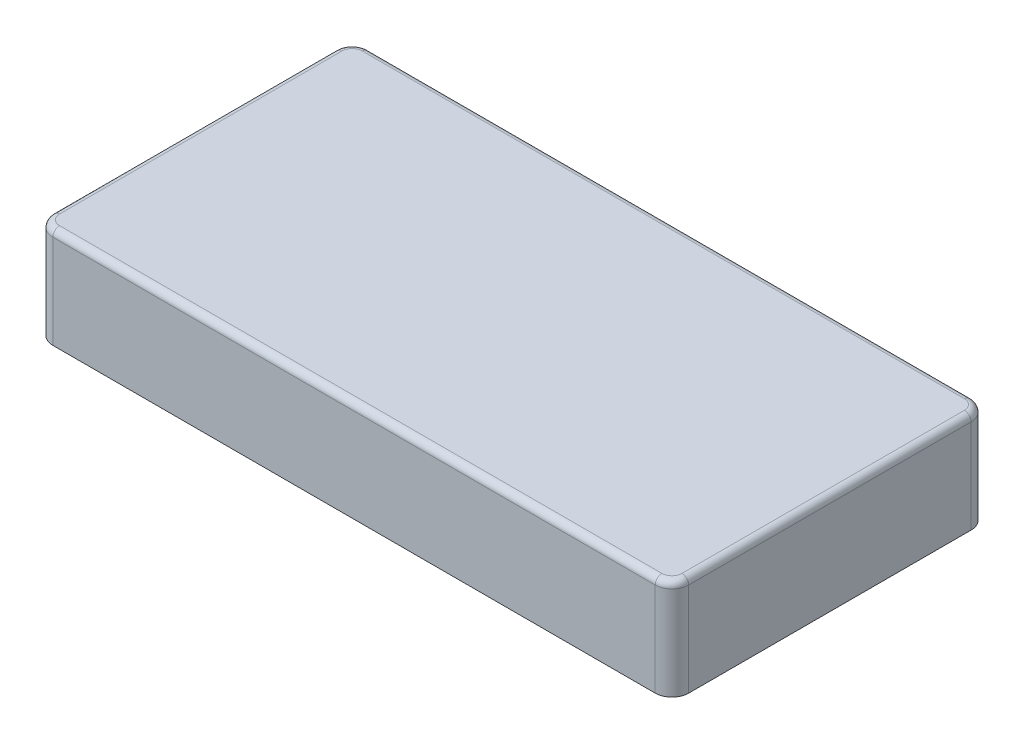
ISO-10303-21;
HEADER;
FILE_DESCRIPTION(('STEP AP214'),'2;1');
FILE_NAME('part.step','',(''),(''),'','','');
FILE_SCHEMA(('AUTOMOTIVE_DESIGN { 1 0 10303 214 1 1 1 1 }'));
ENDSEC;
DATA;
#1=APPLICATION_CONTEXT('core data for automotive mechanical design processes');
#2=APPLICATION_PROTOCOL_DEFINITION('international standard','automotive_design',2000,#1);
#3=PRODUCT_CONTEXT('',#1,'mechanical');
#4=PRODUCT('Part','Part','',(#3));
#5=PRODUCT_RELATED_PRODUCT_CATEGORY('part','',(#4));
#6=PRODUCT_DEFINITION_FORMATION('','',#4);
#7=PRODUCT_DEFINITION_CONTEXT('part definition',#1,'design');
#8=PRODUCT_DEFINITION('design','',#6,#7);
#9=PRODUCT_DEFINITION_SHAPE('','',#8);
#10=(LENGTH_UNIT() NAMED_UNIT(*) SI_UNIT(.MILLI.,.METRE.));
#11=(NAMED_UNIT(*) PLANE_ANGLE_UNIT() SI_UNIT($,.RADIAN.));
#12=(NAMED_UNIT(*) SI_UNIT($,.STERADIAN.) SOLID_ANGLE_UNIT());
#13=UNCERTAINTY_MEASURE_WITH_UNIT(LENGTH_MEASURE(1.E-05),#10,'distance_accuracy_value','');
#14=(GEOMETRIC_REPRESENTATION_CONTEXT(3) GLOBAL_UNCERTAINTY_ASSIGNED_CONTEXT((#13)) GLOBAL_UNIT_ASSIGNED_CONTEXT((#10,
#11,#12)) REPRESENTATION_CONTEXT('',''));
#15=CARTESIAN_POINT('',(0.,0.,0.));
#16=DIRECTION('',(0.,0.,1.));
#17=DIRECTION('',(1.,0.,0.));
#18=AXIS2_PLACEMENT_3D('',#15,#16,#17);
#19=CARTESIAN_POINT('',(9.,3.,-4.22));
#20=DIRECTION('',(0.,-1.,0.));
#21=DIRECTION('',(0.,0.,-1.));
#22=AXIS2_PLACEMENT_3D('',#19,#20,#21);
#23=CYLINDRICAL_SURFACE('',#22,0.5);
#24=DIRECTION('',(0.,-1.,0.));
#25=VECTOR('',#24,1.);
#26=CARTESIAN_POINT('',(9.,3.,-4.72));
#27=LINE('',#26,#25);
#28=CARTESIAN_POINT('',(9.,2.8,-4.72));
#29=VERTEX_POINT('',#28);
#30=CARTESIAN_POINT('',(9.,0.,-4.72));
#31=VERTEX_POINT('',#30);
#32=EDGE_CURVE('E126',#29,#31,#27,.T.);
#33=ORIENTED_EDGE('',*,*,#32,.F.);
#34=CARTESIAN_POINT('',(9.,2.8,-4.22));
#35=DIRECTION('',(0.,-1.,0.));
#36=DIRECTION('',(0.,0.,-1.));
#37=AXIS2_PLACEMENT_3D('',#34,#35,#36);
#38=CIRCLE('',#37,0.5);
#39=CARTESIAN_POINT('',(9.5,2.8,-4.22));
#40=VERTEX_POINT('',#39);
#41=EDGE_CURVE('E200',#29,#40,#38,.T.);
#42=ORIENTED_EDGE('',*,*,#41,.T.);
#43=DIRECTION('',(0.,-1.,0.));
#44=VECTOR('',#43,1.);
#45=CARTESIAN_POINT('',(9.5,3.,-4.22));
#46=LINE('',#45,#44);
#47=CARTESIAN_POINT('',(9.5,0.,-4.22));
#48=VERTEX_POINT('',#47);
#49=EDGE_CURVE('E148',#40,#48,#46,.T.);
#50=ORIENTED_EDGE('',*,*,#49,.T.);
#51=CARTESIAN_POINT('',(9.,0.,-4.22));
#52=DIRECTION('',(0.,1.,0.));
#53=DIRECTION('',(0.,0.,-1.));
#54=AXIS2_PLACEMENT_3D('',#51,#52,#53);
#55=CIRCLE('',#54,0.5);
#56=EDGE_CURVE('E142',#48,#31,#55,.T.);
#57=ORIENTED_EDGE('',*,*,#56,.T.);
#58=EDGE_LOOP('',(#33,#42,#50,#57));
#59=FACE_BOUND('',#58,.T.);
#60=ADVANCED_FACE('F35',(#59),#23,.T.);
#61=CARTESIAN_POINT('',(-9.,3.,-4.72));
#62=DIRECTION('',(0.,0.,1.));
#63=DIRECTION('',(1.,0.,0.));
#64=AXIS2_PLACEMENT_3D('',#61,#62,#63);
#65=PLANE('',#64);
#66=DIRECTION('',(0.,-1.,0.));
#67=VECTOR('',#66,1.);
#68=CARTESIAN_POINT('',(-9.,3.,-4.72));
#69=LINE('',#68,#67);
#70=CARTESIAN_POINT('',(-9.,2.8,-4.72));
#71=VERTEX_POINT('',#70);
#72=CARTESIAN_POINT('',(-9.,0.,-4.72));
#73=VERTEX_POINT('',#72);
#74=EDGE_CURVE('E136',#71,#73,#69,.T.);
#75=ORIENTED_EDGE('',*,*,#74,.F.);
#76=DIRECTION('',(-1.,0.,0.));
#77=VECTOR('',#76,1.);
#78=CARTESIAN_POINT('',(-9.,2.8,-4.72));
#79=LINE('',#78,#77);
#80=EDGE_CURVE('E44',#71,#29,#79,.F.);
#81=ORIENTED_EDGE('',*,*,#80,.T.);
#82=ORIENTED_EDGE('',*,*,#32,.T.);
#83=DIRECTION('',(-1.,0.,0.));
#84=VECTOR('',#83,1.);
#85=CARTESIAN_POINT('',(-9.,0.,-4.72));
#86=LINE('',#85,#84);
#87=EDGE_CURVE('E129',#31,#73,#86,.T.);
#88=ORIENTED_EDGE('',*,*,#87,.T.);
#89=EDGE_LOOP('',(#75,#81,#82,#88));
#90=FACE_BOUND('',#89,.T.);
#91=ADVANCED_FACE('F128',(#90),#65,.F.);
#92=CARTESIAN_POINT('',(-9.,3.,-4.22));
#93=DIRECTION('',(0.,-1.,0.));
#94=DIRECTION('',(0.,0.,-1.));
#95=AXIS2_PLACEMENT_3D('',#92,#93,#94);
#96=CYLINDRICAL_SURFACE('',#95,0.5);
#97=DIRECTION('',(0.,-1.,0.));
#98=VECTOR('',#97,1.);
#99=CARTESIAN_POINT('',(-9.5,3.,-4.22));
#100=LINE('',#99,#98);
#101=CARTESIAN_POINT('',(-9.5,2.8,-4.22));
#102=VERTEX_POINT('',#101);
#103=CARTESIAN_POINT('',(-9.5,0.,-4.22));
#104=VERTEX_POINT('',#103);
#105=EDGE_CURVE('E178',#102,#104,#100,.T.);
#106=ORIENTED_EDGE('',*,*,#105,.F.);
#107=CARTESIAN_POINT('',(-9.,2.8,-4.22));
#108=DIRECTION('',(0.,-1.,0.));
#109=DIRECTION('',(0.,0.,-1.));
#110=AXIS2_PLACEMENT_3D('',#107,#108,#109);
#111=CIRCLE('',#110,0.5);
#112=EDGE_CURVE('E52',#102,#71,#111,.T.);
#113=ORIENTED_EDGE('',*,*,#112,.T.);
#114=ORIENTED_EDGE('',*,*,#74,.T.);
#115=CARTESIAN_POINT('',(-9.,0.,-4.22));
#116=DIRECTION('',(0.,1.,0.));
#117=DIRECTION('',(0.,0.,1.));
#118=AXIS2_PLACEMENT_3D('',#115,#116,#117);
#119=CIRCLE('',#118,0.5);
#120=EDGE_CURVE('E145',#73,#104,#119,.T.);
#121=ORIENTED_EDGE('',*,*,#120,.T.);
#122=EDGE_LOOP('',(#106,#113,#114,#121));
#123=FACE_BOUND('',#122,.T.);
#124=ADVANCED_FACE('F287',(#123),#96,.T.);
#125=CARTESIAN_POINT('',(-9.5,3.,-4.22));
#126=DIRECTION('',(1.,0.,0.));
#127=DIRECTION('',(0.,0.,-1.));
#128=AXIS2_PLACEMENT_3D('',#125,#126,#127);
#129=PLANE('',#128);
#130=DIRECTION('',(0.,-1.,0.));
#131=VECTOR('',#130,1.);
#132=CARTESIAN_POINT('',(-9.5,3.,4.21999999999999));
#133=LINE('',#132,#131);
#134=CARTESIAN_POINT('',(-9.5,2.8,4.21999999999999));
#135=VERTEX_POINT('',#134);
#136=CARTESIAN_POINT('',(-9.5,0.,4.21999999999999));
#137=VERTEX_POINT('',#136);
#138=EDGE_CURVE('E176',#135,#137,#133,.T.);
#139=ORIENTED_EDGE('',*,*,#138,.F.);
#140=DIRECTION('',(0.,0.,1.));
#141=VECTOR('',#140,1.);
#142=CARTESIAN_POINT('',(-9.5,2.8,-4.22));
#143=LINE('',#142,#141);
#144=EDGE_CURVE('E60',#135,#102,#143,.F.);
#145=ORIENTED_EDGE('',*,*,#144,.T.);
#146=ORIENTED_EDGE('',*,*,#105,.T.);
#147=DIRECTION('',(0.,0.,1.));
#148=VECTOR('',#147,1.);
#149=CARTESIAN_POINT('',(-9.5,0.,-4.22));
#150=LINE('',#149,#148);
#151=EDGE_CURVE('E155',#104,#137,#150,.T.);
#152=ORIENTED_EDGE('',*,*,#151,.T.);
#153=EDGE_LOOP('',(#139,#145,#146,#152));
#154=FACE_BOUND('',#153,.T.);
#155=ADVANCED_FACE('F386',(#154),#129,.F.);
#156=CARTESIAN_POINT('',(-9.,3.,4.22));
#157=DIRECTION('',(0.,-1.,0.));
#158=DIRECTION('',(0.,0.,-1.));
#159=AXIS2_PLACEMENT_3D('',#156,#157,#158);
#160=CYLINDRICAL_SURFACE('',#159,0.5);
#161=DIRECTION('',(0.,-1.,0.));
#162=VECTOR('',#161,1.);
#163=CARTESIAN_POINT('',(-9.,3.,4.72));
#164=LINE('',#163,#162);
#165=CARTESIAN_POINT('',(-9.,2.8,4.72));
#166=VERTEX_POINT('',#165);
#167=CARTESIAN_POINT('',(-9.,0.,4.72));
#168=VERTEX_POINT('',#167);
#169=EDGE_CURVE('E174',#166,#168,#164,.T.);
#170=ORIENTED_EDGE('',*,*,#169,.F.);
#171=CARTESIAN_POINT('',(-9.,2.8,4.22));
#172=DIRECTION('',(0.,-1.,0.));
#173=DIRECTION('',(0.,0.,-1.));
#174=AXIS2_PLACEMENT_3D('',#171,#172,#173);
#175=CIRCLE('',#174,0.5);
#176=EDGE_CURVE('E204',#166,#135,#175,.T.);
#177=ORIENTED_EDGE('',*,*,#176,.T.);
#178=ORIENTED_EDGE('',*,*,#138,.T.);
#179=CARTESIAN_POINT('',(-9.,0.,4.22));
#180=DIRECTION('',(0.,1.,0.));
#181=DIRECTION('',(0.,0.,-1.));
#182=AXIS2_PLACEMENT_3D('',#179,#180,#181);
#183=CIRCLE('',#182,0.5);
#184=EDGE_CURVE('E158',#137,#168,#183,.T.);
#185=ORIENTED_EDGE('',*,*,#184,.T.);
#186=EDGE_LOOP('',(#170,#177,#178,#185));
#187=FACE_BOUND('',#186,.T.);
#188=ADVANCED_FACE('F268',(#187),#160,.T.);
#189=CARTESIAN_POINT('',(-9.,3.,4.72));
#190=DIRECTION('',(0.,0.,-1.));
#191=DIRECTION('',(-1.,0.,0.));
#192=AXIS2_PLACEMENT_3D('',#189,#190,#191);
#193=PLANE('',#192);
#194=DIRECTION('',(0.,-1.,0.));
#195=VECTOR('',#194,1.);
#196=CARTESIAN_POINT('',(8.99999999999999,3.,4.72));
#197=LINE('',#196,#195);
#198=CARTESIAN_POINT('',(8.99999999999999,2.8,4.72));
#199=VERTEX_POINT('',#198);
#200=CARTESIAN_POINT('',(8.99999999999999,0.,4.72));
#201=VERTEX_POINT('',#200);
#202=EDGE_CURVE('E172',#199,#201,#197,.T.);
#203=ORIENTED_EDGE('',*,*,#202,.F.);
#204=DIRECTION('',(1.,0.,0.));
#205=VECTOR('',#204,1.);
#206=CARTESIAN_POINT('',(-9.,2.8,4.72));
#207=LINE('',#206,#205);
#208=EDGE_CURVE('E11',#199,#166,#207,.F.);
#209=ORIENTED_EDGE('',*,*,#208,.T.);
#210=ORIENTED_EDGE('',*,*,#169,.T.);
#211=DIRECTION('',(1.,0.,0.));
#212=VECTOR('',#211,1.);
#213=CARTESIAN_POINT('',(-9.,0.,4.72));
#214=LINE('',#213,#212);
#215=EDGE_CURVE('E161',#168,#201,#214,.T.);
#216=ORIENTED_EDGE('',*,*,#215,.T.);
#217=EDGE_LOOP('',(#203,#209,#210,#216));
#218=FACE_BOUND('',#217,.T.);
#219=ADVANCED_FACE('F265',(#218),#193,.F.);
#220=CARTESIAN_POINT('',(9.,3.,4.22));
#221=DIRECTION('',(0.,-1.,0.));
#222=DIRECTION('',(0.,0.,-1.));
#223=AXIS2_PLACEMENT_3D('',#220,#221,#222);
#224=CYLINDRICAL_SURFACE('',#223,0.5);
#225=DIRECTION('',(0.,-1.,0.));
#226=VECTOR('',#225,1.);
#227=CARTESIAN_POINT('',(9.5,3.,4.21999999999999));
#228=LINE('',#227,#226);
#229=CARTESIAN_POINT('',(9.5,2.8,4.21999999999999));
#230=VERTEX_POINT('',#229);
#231=CARTESIAN_POINT('',(9.5,0.,4.21999999999999));
#232=VERTEX_POINT('',#231);
#233=EDGE_CURVE('E170',#230,#232,#228,.T.);
#234=ORIENTED_EDGE('',*,*,#233,.F.);
#235=CARTESIAN_POINT('',(9.,2.8,4.22));
#236=DIRECTION('',(0.,-1.,0.));
#237=DIRECTION('',(0.,0.,-1.));
#238=AXIS2_PLACEMENT_3D('',#235,#236,#237);
#239=CIRCLE('',#238,0.5);
#240=EDGE_CURVE('E197',#230,#199,#239,.T.);
#241=ORIENTED_EDGE('',*,*,#240,.T.);
#242=ORIENTED_EDGE('',*,*,#202,.T.);
#243=CARTESIAN_POINT('',(9.,0.,4.22));
#244=DIRECTION('',(0.,1.,0.));
#245=DIRECTION('',(0.,0.,-1.));
#246=AXIS2_PLACEMENT_3D('',#243,#244,#245);
#247=CIRCLE('',#246,0.5);
#248=EDGE_CURVE('E164',#201,#232,#247,.T.);
#249=ORIENTED_EDGE('',*,*,#248,.T.);
#250=EDGE_LOOP('',(#234,#241,#242,#249));
#251=FACE_BOUND('',#250,.T.);
#252=ADVANCED_FACE('F251',(#251),#224,.T.);
#253=CARTESIAN_POINT('',(9.5,3.,-4.22));
#254=DIRECTION('',(-1.,0.,0.));
#255=DIRECTION('',(0.,0.,1.));
#256=AXIS2_PLACEMENT_3D('',#253,#254,#255);
#257=PLANE('',#256);
#258=ORIENTED_EDGE('',*,*,#49,.F.);
#259=DIRECTION('',(0.,0.,-1.));
#260=VECTOR('',#259,1.);
#261=CARTESIAN_POINT('',(9.5,2.8,-4.22));
#262=LINE('',#261,#260);
#263=EDGE_CURVE('E202',#40,#230,#262,.F.);
#264=ORIENTED_EDGE('',*,*,#263,.T.);
#265=ORIENTED_EDGE('',*,*,#233,.T.);
#266=DIRECTION('',(0.,0.,-1.));
#267=VECTOR('',#266,1.);
#268=CARTESIAN_POINT('',(9.5,0.,-4.22));
#269=LINE('',#268,#267);
#270=EDGE_CURVE('E167',#232,#48,#269,.T.);
#271=ORIENTED_EDGE('',*,*,#270,.T.);
#272=EDGE_LOOP('',(#258,#264,#265,#271));
#273=FACE_BOUND('',#272,.T.);
#274=ADVANCED_FACE('F248',(#273),#257,.F.);
#275=CARTESIAN_POINT('',(9.,3.,-4.22));
#276=DIRECTION('',(0.,-1.,0.));
#277=DIRECTION('',(0.,0.,-1.));
#278=AXIS2_PLACEMENT_3D('',#275,#276,#277);
#279=PLANE('',#278);
#280=CARTESIAN_POINT('',(9.,3.,-4.22));
#281=DIRECTION('',(0.,-1.,0.));
#282=DIRECTION('',(0.,0.,-1.));
#283=AXIS2_PLACEMENT_3D('',#280,#281,#282);
#284=CIRCLE('',#283,0.3);
#285=CARTESIAN_POINT('',(9.3,3.,-4.22));
#286=VERTEX_POINT('',#285);
#287=CARTESIAN_POINT('',(9.,3.,-4.52));
#288=VERTEX_POINT('',#287);
#289=EDGE_CURVE('E193',#286,#288,#284,.F.);
#290=ORIENTED_EDGE('',*,*,#289,.T.);
#291=DIRECTION('',(-1.,0.,0.));
#292=VECTOR('',#291,1.);
#293=CARTESIAN_POINT('',(9.,3.,-4.52));
#294=LINE('',#293,#292);
#295=CARTESIAN_POINT('',(-9.,3.,-4.52));
#296=VERTEX_POINT('',#295);
#297=EDGE_CURVE('E195',#288,#296,#294,.T.);
#298=ORIENTED_EDGE('',*,*,#297,.T.);
#299=CARTESIAN_POINT('',(-9.,3.,-4.22));
#300=DIRECTION('',(0.,-1.,0.));
#301=DIRECTION('',(0.,0.,-1.));
#302=AXIS2_PLACEMENT_3D('',#299,#300,#301);
#303=CIRCLE('',#302,0.3);
#304=CARTESIAN_POINT('',(-9.3,3.,-4.22));
#305=VERTEX_POINT('',#304);
#306=EDGE_CURVE('E189',#296,#305,#303,.F.);
#307=ORIENTED_EDGE('',*,*,#306,.T.);
#308=DIRECTION('',(0.,0.,1.));
#309=VECTOR('',#308,1.);
#310=CARTESIAN_POINT('',(-9.3,3.,-4.22));
#311=LINE('',#310,#309);
#312=CARTESIAN_POINT('',(-9.3,3.,4.22));
#313=VERTEX_POINT('',#312);
#314=EDGE_CURVE('E187',#305,#313,#311,.T.);
#315=ORIENTED_EDGE('',*,*,#314,.T.);
#316=CARTESIAN_POINT('',(-9.,3.,4.22));
#317=DIRECTION('',(0.,-1.,0.));
#318=DIRECTION('',(0.,0.,-1.));
#319=AXIS2_PLACEMENT_3D('',#316,#317,#318);
#320=CIRCLE('',#319,0.3);
#321=CARTESIAN_POINT('',(-9.,3.,4.52));
#322=VERTEX_POINT('',#321);
#323=EDGE_CURVE('E182',#313,#322,#320,.F.);
#324=ORIENTED_EDGE('',*,*,#323,.T.);
#325=DIRECTION('',(1.,0.,0.));
#326=VECTOR('',#325,1.);
#327=CARTESIAN_POINT('',(9.,3.,4.52));
#328=LINE('',#327,#326);
#329=CARTESIAN_POINT('',(9.,3.,4.52));
#330=VERTEX_POINT('',#329);
#331=EDGE_CURVE('E135',#322,#330,#328,.T.);
#332=ORIENTED_EDGE('',*,*,#331,.T.);
#333=CARTESIAN_POINT('',(9.,3.,4.22));
#334=DIRECTION('',(0.,-1.,0.));
#335=DIRECTION('',(0.,0.,-1.));
#336=AXIS2_PLACEMENT_3D('',#333,#334,#335);
#337=CIRCLE('',#336,0.3);
#338=CARTESIAN_POINT('',(9.3,3.,4.22));
#339=VERTEX_POINT('',#338);
#340=EDGE_CURVE('E184',#330,#339,#337,.F.);
#341=ORIENTED_EDGE('',*,*,#340,.T.);
#342=DIRECTION('',(0.,0.,-1.));
#343=VECTOR('',#342,1.);
#344=CARTESIAN_POINT('',(9.3,3.,-4.22));
#345=LINE('',#344,#343);
#346=EDGE_CURVE('E191',#339,#286,#345,.T.);
#347=ORIENTED_EDGE('',*,*,#346,.T.);
#348=EDGE_LOOP('',(#290,#298,#307,#315,#324,#332,#341,#347));
#349=FACE_BOUND('',#348,.T.);
#350=ADVANCED_FACE('F234',(#349),#279,.F.);
#351=CARTESIAN_POINT('',(9.,0.,-4.22));
#352=DIRECTION('',(0.,-1.,0.));
#353=DIRECTION('',(0.,0.,-1.));
#354=AXIS2_PLACEMENT_3D('',#351,#352,#353);
#355=PLANE('',#354);
#356=ORIENTED_EDGE('',*,*,#56,.F.);
#357=ORIENTED_EDGE('',*,*,#270,.F.);
#358=ORIENTED_EDGE('',*,*,#248,.F.);
#359=ORIENTED_EDGE('',*,*,#215,.F.);
#360=ORIENTED_EDGE('',*,*,#184,.F.);
#361=ORIENTED_EDGE('',*,*,#151,.F.);
#362=ORIENTED_EDGE('',*,*,#120,.F.);
#363=ORIENTED_EDGE('',*,*,#87,.F.);
#364=EDGE_LOOP('',(#356,#357,#358,#359,#360,#361,#362,#363));
#365=FACE_BOUND('',#364,.T.);
#366=ADVANCED_FACE('F140',(#365),#355,.T.);
#367=CARTESIAN_POINT('',(-9.,2.8,-4.22));
#368=DIRECTION('',(0.,-1.,0.));
#369=DIRECTION('',(0.,0.,-1.));
#370=AXIS2_PLACEMENT_3D('',#367,#368,#369);
#371=TOROIDAL_SURFACE('',#370,0.3,0.2);
#372=CARTESIAN_POINT('',(-9.,2.8,-4.52));
#373=DIRECTION('',(1.,0.,0.));
#374=DIRECTION('',(0.,0.,-1.));
#375=AXIS2_PLACEMENT_3D('',#372,#373,#374);
#376=CIRCLE('',#375,0.2);
#377=EDGE_CURVE('E152',#71,#296,#376,.T.);
#378=ORIENTED_EDGE('',*,*,#377,.F.);
#379=ORIENTED_EDGE('',*,*,#112,.F.);
#380=CARTESIAN_POINT('',(-9.3,2.8,-4.22));
#381=DIRECTION('',(0.,0.,1.));
#382=DIRECTION('',(1.,0.,0.));
#383=AXIS2_PLACEMENT_3D('',#380,#381,#382);
#384=CIRCLE('',#383,0.2);
#385=EDGE_CURVE('E39',#305,#102,#384,.T.);
#386=ORIENTED_EDGE('',*,*,#385,.F.);
#387=ORIENTED_EDGE('',*,*,#306,.F.);
#388=EDGE_LOOP('',(#378,#379,#386,#387));
#389=FACE_BOUND('',#388,.T.);
#390=ADVANCED_FACE('F37',(#389),#371,.T.);
#391=CARTESIAN_POINT('',(-9.3,2.8,-4.22));
#392=DIRECTION('',(0.,0.,1.));
#393=DIRECTION('',(1.,0.,0.));
#394=AXIS2_PLACEMENT_3D('',#391,#392,#393);
#395=CYLINDRICAL_SURFACE('',#394,0.2);
#396=ORIENTED_EDGE('',*,*,#385,.T.);
#397=ORIENTED_EDGE('',*,*,#144,.F.);
#398=CARTESIAN_POINT('',(-9.3,2.8,4.22));
#399=DIRECTION('',(0.,0.,1.));
#400=DIRECTION('',(1.,0.,0.));
#401=AXIS2_PLACEMENT_3D('',#398,#399,#400);
#402=CIRCLE('',#401,0.2);
#403=EDGE_CURVE('E222',#313,#135,#402,.T.);
#404=ORIENTED_EDGE('',*,*,#403,.F.);
#405=ORIENTED_EDGE('',*,*,#314,.F.);
#406=EDGE_LOOP('',(#396,#397,#404,#405));
#407=FACE_BOUND('',#406,.T.);
#408=ADVANCED_FACE('F275',(#407),#395,.T.);
#409=CARTESIAN_POINT('',(9.,2.8,-4.52));
#410=DIRECTION('',(-1.,0.,0.));
#411=DIRECTION('',(0.,0.,1.));
#412=AXIS2_PLACEMENT_3D('',#409,#410,#411);
#413=CYLINDRICAL_SURFACE('',#412,0.2);
#414=ORIENTED_EDGE('',*,*,#377,.T.);
#415=ORIENTED_EDGE('',*,*,#297,.F.);
#416=CARTESIAN_POINT('',(9.,2.8,-4.52));
#417=DIRECTION('',(1.,0.,0.));
#418=DIRECTION('',(0.,1.,0.));
#419=AXIS2_PLACEMENT_3D('',#416,#417,#418);
#420=CIRCLE('',#419,0.2);
#421=EDGE_CURVE('E219',#29,#288,#420,.T.);
#422=ORIENTED_EDGE('',*,*,#421,.F.);
#423=ORIENTED_EDGE('',*,*,#80,.F.);
#424=EDGE_LOOP('',(#414,#415,#422,#423));
#425=FACE_BOUND('',#424,.T.);
#426=ADVANCED_FACE('F228',(#425),#413,.T.);
#427=CARTESIAN_POINT('',(-9.,2.8,4.22));
#428=DIRECTION('',(0.,-1.,0.));
#429=DIRECTION('',(0.,0.,-1.));
#430=AXIS2_PLACEMENT_3D('',#427,#428,#429);
#431=TOROIDAL_SURFACE('',#430,0.3,0.2);
#432=ORIENTED_EDGE('',*,*,#403,.T.);
#433=ORIENTED_EDGE('',*,*,#176,.F.);
#434=CARTESIAN_POINT('',(-9.,2.8,4.52));
#435=DIRECTION('',(1.,0.,0.));
#436=DIRECTION('',(0.,0.,-1.));
#437=AXIS2_PLACEMENT_3D('',#434,#435,#436);
#438=CIRCLE('',#437,0.2);
#439=EDGE_CURVE('E216',#322,#166,#438,.T.);
#440=ORIENTED_EDGE('',*,*,#439,.F.);
#441=ORIENTED_EDGE('',*,*,#323,.F.);
#442=EDGE_LOOP('',(#432,#433,#440,#441));
#443=FACE_BOUND('',#442,.T.);
#444=ADVANCED_FACE('F272',(#443),#431,.T.);
#445=CARTESIAN_POINT('',(9.,2.8,-4.22));
#446=DIRECTION('',(0.,-1.,0.));
#447=DIRECTION('',(0.,0.,-1.));
#448=AXIS2_PLACEMENT_3D('',#445,#446,#447);
#449=TOROIDAL_SURFACE('',#448,0.3,0.2);
#450=ORIENTED_EDGE('',*,*,#421,.T.);
#451=ORIENTED_EDGE('',*,*,#289,.F.);
#452=CARTESIAN_POINT('',(9.3,2.8,-4.22));
#453=DIRECTION('',(0.,0.,1.));
#454=DIRECTION('',(1.,0.,0.));
#455=AXIS2_PLACEMENT_3D('',#452,#453,#454);
#456=CIRCLE('',#455,0.2);
#457=EDGE_CURVE('E213',#40,#286,#456,.T.);
#458=ORIENTED_EDGE('',*,*,#457,.F.);
#459=ORIENTED_EDGE('',*,*,#41,.F.);
#460=EDGE_LOOP('',(#450,#451,#458,#459));
#461=FACE_BOUND('',#460,.T.);
#462=ADVANCED_FACE('F240',(#461),#449,.T.);
#463=CARTESIAN_POINT('',(9.,2.8,4.52));
#464=DIRECTION('',(1.,0.,0.));
#465=DIRECTION('',(0.,0.,-1.));
#466=AXIS2_PLACEMENT_3D('',#463,#464,#465);
#467=CYLINDRICAL_SURFACE('',#466,0.2);
#468=ORIENTED_EDGE('',*,*,#439,.T.);
#469=ORIENTED_EDGE('',*,*,#208,.F.);
#470=CARTESIAN_POINT('',(9.,2.8,4.52));
#471=DIRECTION('',(1.,0.,0.));
#472=DIRECTION('',(0.,0.,-1.));
#473=AXIS2_PLACEMENT_3D('',#470,#471,#472);
#474=CIRCLE('',#473,0.2);
#475=EDGE_CURVE('E211',#330,#199,#474,.T.);
#476=ORIENTED_EDGE('',*,*,#475,.F.);
#477=ORIENTED_EDGE('',*,*,#331,.F.);
#478=EDGE_LOOP('',(#468,#469,#476,#477));
#479=FACE_BOUND('',#478,.T.);
#480=ADVANCED_FACE('F261',(#479),#467,.T.);
#481=CARTESIAN_POINT('',(9.3,2.8,-4.22));
#482=DIRECTION('',(0.,0.,-1.));
#483=DIRECTION('',(-1.,0.,0.));
#484=AXIS2_PLACEMENT_3D('',#481,#482,#483);
#485=CYLINDRICAL_SURFACE('',#484,0.2);
#486=ORIENTED_EDGE('',*,*,#457,.T.);
#487=ORIENTED_EDGE('',*,*,#346,.F.);
#488=CARTESIAN_POINT('',(9.3,2.8,4.21999999999999));
#489=DIRECTION('',(0.,0.,1.));
#490=DIRECTION('',(0.,-1.,0.));
#491=AXIS2_PLACEMENT_3D('',#488,#489,#490);
#492=CIRCLE('',#491,0.2);
#493=EDGE_CURVE('E209',#230,#339,#492,.T.);
#494=ORIENTED_EDGE('',*,*,#493,.F.);
#495=ORIENTED_EDGE('',*,*,#263,.F.);
#496=EDGE_LOOP('',(#486,#487,#494,#495));
#497=FACE_BOUND('',#496,.T.);
#498=ADVANCED_FACE('F244',(#497),#485,.T.);
#499=CARTESIAN_POINT('',(9.,2.8,4.22));
#500=DIRECTION('',(0.,-1.,0.));
#501=DIRECTION('',(0.,0.,-1.));
#502=AXIS2_PLACEMENT_3D('',#499,#500,#501);
#503=TOROIDAL_SURFACE('',#502,0.3,0.2);
#504=ORIENTED_EDGE('',*,*,#475,.T.);
#505=ORIENTED_EDGE('',*,*,#240,.F.);
#506=ORIENTED_EDGE('',*,*,#493,.T.);
#507=ORIENTED_EDGE('',*,*,#340,.F.);
#508=EDGE_LOOP('',(#504,#505,#506,#507));
#509=FACE_BOUND('',#508,.T.);
#510=ADVANCED_FACE('F255',(#509),#503,.T.);
#511=CLOSED_SHELL('',(#60,#91,#124,#155,#188,#219,#252,#274,#350,#366,#390,#408,#426,#444,#462,
#480,#498,#510));
#512=MANIFOLD_SOLID_BREP('B2',#511);
#513=ADVANCED_BREP_SHAPE_REPRESENTATION('',(#18,#512),#14);
#514=SHAPE_DEFINITION_REPRESENTATION(#9,#513);
ENDSEC;
END-ISO-10303-21;
